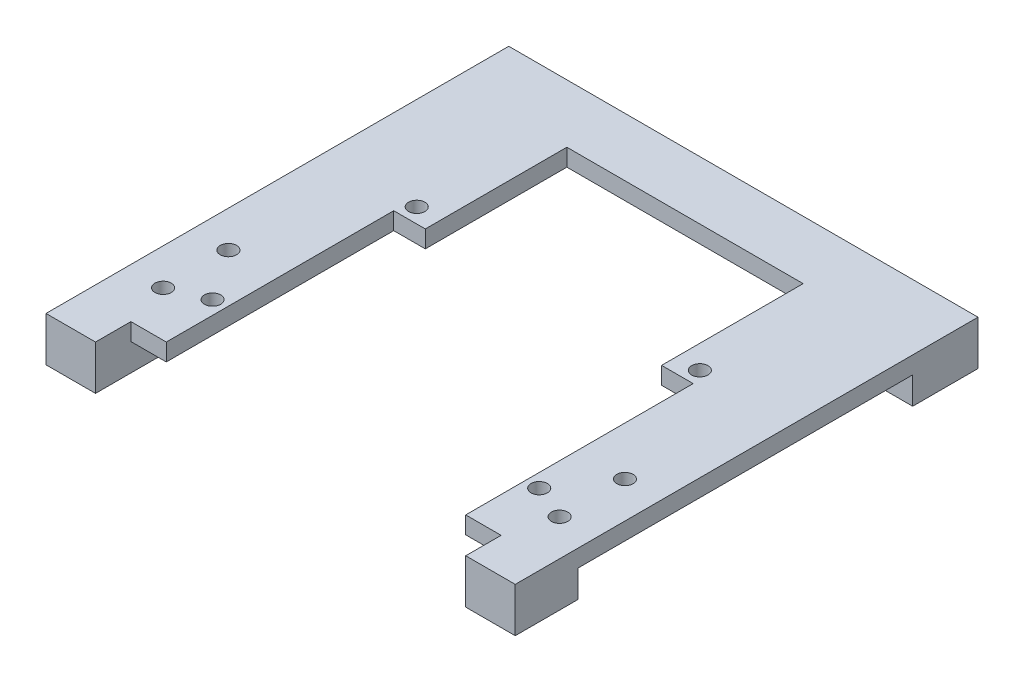
ISO-10303-21;
HEADER;
FILE_DESCRIPTION(('STEP AP214'),'2;1');
FILE_NAME('part.step','',(''),(''),'','','');
FILE_SCHEMA(('AUTOMOTIVE_DESIGN { 1 0 10303 214 1 1 1 1 }'));
ENDSEC;
DATA;
#1=APPLICATION_CONTEXT('core data for automotive mechanical design processes');
#2=APPLICATION_PROTOCOL_DEFINITION('international standard','automotive_design',2000,#1);
#3=PRODUCT_CONTEXT('',#1,'mechanical');
#4=PRODUCT('Part','Part','',(#3));
#5=PRODUCT_RELATED_PRODUCT_CATEGORY('part','',(#4));
#6=PRODUCT_DEFINITION_FORMATION('','',#4);
#7=PRODUCT_DEFINITION_CONTEXT('part definition',#1,'design');
#8=PRODUCT_DEFINITION('design','',#6,#7);
#9=PRODUCT_DEFINITION_SHAPE('','',#8);
#10=(LENGTH_UNIT() NAMED_UNIT(*) SI_UNIT(.MILLI.,.METRE.));
#11=(NAMED_UNIT(*) PLANE_ANGLE_UNIT() SI_UNIT($,.RADIAN.));
#12=(NAMED_UNIT(*) SI_UNIT($,.STERADIAN.) SOLID_ANGLE_UNIT());
#13=UNCERTAINTY_MEASURE_WITH_UNIT(LENGTH_MEASURE(1.E-05),#10,'distance_accuracy_value','');
#14=(GEOMETRIC_REPRESENTATION_CONTEXT(3) GLOBAL_UNCERTAINTY_ASSIGNED_CONTEXT((#13)) GLOBAL_UNIT_ASSIGNED_CONTEXT((#10,
#11,#12)) REPRESENTATION_CONTEXT('',''));
#15=CARTESIAN_POINT('',(0.,0.,0.));
#16=DIRECTION('',(0.,0.,1.));
#17=DIRECTION('',(1.,0.,0.));
#18=AXIS2_PLACEMENT_3D('',#15,#16,#17);
#19=CARTESIAN_POINT('',(27.5,-6.825,58.5499999999924));
#20=DIRECTION('',(1.,0.,0.));
#21=DIRECTION('',(0.,0.,-1.));
#22=AXIS2_PLACEMENT_3D('',#19,#20,#21);
#23=PLANE('',#22);
#24=DIRECTION('',(0.,1.,0.));
#25=VECTOR('',#24,1.);
#26=CARTESIAN_POINT('',(27.5,0.,16.5499999999924));
#27=LINE('',#26,#25);
#28=CARTESIAN_POINT('',(27.5,0.,16.5499999999924));
#29=VERTEX_POINT('',#28);
#30=CARTESIAN_POINT('',(27.5,3.175,16.5499999999924));
#31=VERTEX_POINT('',#30);
#32=EDGE_CURVE('E68',#29,#31,#27,.T.);
#33=ORIENTED_EDGE('',*,*,#32,.F.);
#34=DIRECTION('',(0.,0.,-1.));
#35=VECTOR('',#34,1.);
#36=CARTESIAN_POINT('',(27.5,0.,0.));
#37=LINE('',#36,#35);
#38=CARTESIAN_POINT('',(27.5,0.,58.3266002747816));
#39=VERTEX_POINT('',#38);
#40=EDGE_CURVE('E490',#39,#29,#37,.T.);
#41=ORIENTED_EDGE('',*,*,#40,.F.);
#42=DIRECTION('',(0.,-1.,0.));
#43=VECTOR('',#42,1.);
#44=CARTESIAN_POINT('',(27.5,0.,58.3266002747816));
#45=LINE('',#44,#43);
#46=CARTESIAN_POINT('',(27.5,3.175,58.3266002747816));
#47=VERTEX_POINT('',#46);
#48=EDGE_CURVE('E324',#47,#39,#45,.T.);
#49=ORIENTED_EDGE('',*,*,#48,.F.);
#50=DIRECTION('',(0.,0.,-1.));
#51=VECTOR('',#50,1.);
#52=CARTESIAN_POINT('',(27.5,3.175,58.5499999999924));
#53=LINE('',#52,#51);
#54=EDGE_CURVE('E64',#47,#31,#53,.T.);
#55=ORIENTED_EDGE('',*,*,#54,.T.);
#56=EDGE_LOOP('',(#33,#41,#49,#55));
#57=FACE_BOUND('',#56,.T.);
#58=ADVANCED_FACE('F48',(#57),#23,.F.);
#59=CARTESIAN_POINT('',(-27.5,-6.825,58.5499999999924));
#60=DIRECTION('',(-1.,0.,0.));
#61=DIRECTION('',(0.,0.,1.));
#62=AXIS2_PLACEMENT_3D('',#59,#60,#61);
#63=PLANE('',#62);
#64=DIRECTION('',(0.,-1.,0.));
#65=VECTOR('',#64,1.);
#66=CARTESIAN_POINT('',(-27.5,0.,16.5499999999924));
#67=LINE('',#66,#65);
#68=CARTESIAN_POINT('',(-27.5,3.175,16.5499999999924));
#69=VERTEX_POINT('',#68);
#70=CARTESIAN_POINT('',(-27.5,0.,16.5499999999924));
#71=VERTEX_POINT('',#70);
#72=EDGE_CURVE('E284',#69,#71,#67,.T.);
#73=ORIENTED_EDGE('',*,*,#72,.F.);
#74=DIRECTION('',(0.,0.,1.));
#75=VECTOR('',#74,1.);
#76=CARTESIAN_POINT('',(-27.5,3.175,58.5499999999924));
#77=LINE('',#76,#75);
#78=CARTESIAN_POINT('',(-27.5,3.175,58.3266002747816));
#79=VERTEX_POINT('',#78);
#80=EDGE_CURVE('E485',#69,#79,#77,.T.);
#81=ORIENTED_EDGE('',*,*,#80,.T.);
#82=DIRECTION('',(0.,1.,0.));
#83=VECTOR('',#82,1.);
#84=CARTESIAN_POINT('',(-27.5,0.,58.3266002747816));
#85=LINE('',#84,#83);
#86=CARTESIAN_POINT('',(-27.5,0.,58.3266002747816));
#87=VERTEX_POINT('',#86);
#88=EDGE_CURVE('E344',#87,#79,#85,.T.);
#89=ORIENTED_EDGE('',*,*,#88,.F.);
#90=DIRECTION('',(0.,0.,1.));
#91=VECTOR('',#90,1.);
#92=CARTESIAN_POINT('',(-27.5,0.,0.));
#93=LINE('',#92,#91);
#94=EDGE_CURVE('E493',#71,#87,#93,.T.);
#95=ORIENTED_EDGE('',*,*,#94,.F.);
#96=EDGE_LOOP('',(#73,#81,#89,#95));
#97=FACE_BOUND('',#96,.T.);
#98=ADVANCED_FACE('F613',(#97),#63,.F.);
#99=CARTESIAN_POINT('',(34.,3.175,0.));
#100=DIRECTION('',(-1.,0.,0.));
#101=DIRECTION('',(0.,0.,1.));
#102=AXIS2_PLACEMENT_3D('',#99,#100,#101);
#103=PLANE('',#102);
#104=DIRECTION('',(0.,1.,0.));
#105=VECTOR('',#104,1.);
#106=CARTESIAN_POINT('',(34.,0.,58.3266002747816));
#107=LINE('',#106,#105);
#108=CARTESIAN_POINT('',(34.,0.,58.3266002747816));
#109=VERTEX_POINT('',#108);
#110=CARTESIAN_POINT('',(34.,3.175,58.3266002747816));
#111=VERTEX_POINT('',#110);
#112=EDGE_CURVE('E332',#109,#111,#107,.T.);
#113=ORIENTED_EDGE('',*,*,#112,.F.);
#114=DIRECTION('',(0.,0.,-1.));
#115=VECTOR('',#114,1.);
#116=CARTESIAN_POINT('',(34.,0.,58.3266002747816));
#117=LINE('',#116,#115);
#118=CARTESIAN_POINT('',(34.,0.,53.3266002747816));
#119=VERTEX_POINT('',#118);
#120=EDGE_CURVE('E318',#109,#119,#117,.T.);
#121=ORIENTED_EDGE('',*,*,#120,.T.);
#122=DIRECTION('',(0.,1.,0.));
#123=VECTOR('',#122,1.);
#124=CARTESIAN_POINT('',(34.,-5.,53.3266002747816));
#125=LINE('',#124,#123);
#126=CARTESIAN_POINT('',(34.,-5.,53.3266002747816));
#127=VERTEX_POINT('',#126);
#128=EDGE_CURVE('E407',#127,#119,#125,.T.);
#129=ORIENTED_EDGE('',*,*,#128,.F.);
#130=DIRECTION('',(0.,0.,-1.));
#131=VECTOR('',#130,1.);
#132=CARTESIAN_POINT('',(34.,-5.,64.8266002747816));
#133=LINE('',#132,#131);
#134=CARTESIAN_POINT('',(34.,-5.,64.8266002747816));
#135=VERTEX_POINT('',#134);
#136=EDGE_CURVE('E435',#135,#127,#133,.T.);
#137=ORIENTED_EDGE('',*,*,#136,.F.);
#138=DIRECTION('',(0.,-1.,0.));
#139=VECTOR('',#138,1.);
#140=CARTESIAN_POINT('',(34.,3.175,64.8266002747816));
#141=LINE('',#140,#139);
#142=CARTESIAN_POINT('',(34.,3.175,64.8266002747816));
#143=VERTEX_POINT('',#142);
#144=EDGE_CURVE('E12',#143,#135,#141,.T.);
#145=ORIENTED_EDGE('',*,*,#144,.F.);
#146=DIRECTION('',(0.,0.,-1.));
#147=VECTOR('',#146,1.);
#148=CARTESIAN_POINT('',(34.,3.175,0.));
#149=LINE('',#148,#147);
#150=EDGE_CURVE('E532',#143,#111,#149,.T.);
#151=ORIENTED_EDGE('',*,*,#150,.T.);
#152=EDGE_LOOP('',(#113,#121,#129,#137,#145,#151));
#153=FACE_BOUND('',#152,.T.);
#154=ADVANCED_FACE('F607',(#153),#103,.T.);
#155=CARTESIAN_POINT('',(-34.,3.175,0.));
#156=DIRECTION('',(1.,0.,0.));
#157=DIRECTION('',(0.,0.,-1.));
#158=AXIS2_PLACEMENT_3D('',#155,#156,#157);
#159=PLANE('',#158);
#160=DIRECTION('',(0.,1.,0.));
#161=VECTOR('',#160,1.);
#162=CARTESIAN_POINT('',(-34.,-5.,53.3266002747816));
#163=LINE('',#162,#161);
#164=CARTESIAN_POINT('',(-34.,-5.,53.3266002747816));
#165=VERTEX_POINT('',#164);
#166=CARTESIAN_POINT('',(-34.,0.,53.3266002747816));
#167=VERTEX_POINT('',#166);
#168=EDGE_CURVE('E460',#165,#167,#163,.T.);
#169=ORIENTED_EDGE('',*,*,#168,.T.);
#170=DIRECTION('',(0.,0.,-1.));
#171=VECTOR('',#170,1.);
#172=CARTESIAN_POINT('',(-34.,0.,58.3266002747816));
#173=LINE('',#172,#171);
#174=CARTESIAN_POINT('',(-34.,0.,58.3266002747816));
#175=VERTEX_POINT('',#174);
#176=EDGE_CURVE('E352',#175,#167,#173,.T.);
#177=ORIENTED_EDGE('',*,*,#176,.F.);
#178=DIRECTION('',(0.,-1.,0.));
#179=VECTOR('',#178,1.);
#180=CARTESIAN_POINT('',(-34.,0.,58.3266002747816));
#181=LINE('',#180,#179);
#182=CARTESIAN_POINT('',(-34.,3.175,58.3266002747816));
#183=VERTEX_POINT('',#182);
#184=EDGE_CURVE('E336',#183,#175,#181,.T.);
#185=ORIENTED_EDGE('',*,*,#184,.F.);
#186=DIRECTION('',(0.,0.,1.));
#187=VECTOR('',#186,1.);
#188=CARTESIAN_POINT('',(-34.,3.175,0.));
#189=LINE('',#188,#187);
#190=CARTESIAN_POINT('',(-34.,3.175,64.8266002747816));
#191=VERTEX_POINT('',#190);
#192=EDGE_CURVE('E529',#183,#191,#189,.T.);
#193=ORIENTED_EDGE('',*,*,#192,.T.);
#194=DIRECTION('',(0.,-1.,0.));
#195=VECTOR('',#194,1.);
#196=CARTESIAN_POINT('',(-34.,3.175,64.8266002747816));
#197=LINE('',#196,#195);
#198=CARTESIAN_POINT('',(-34.,-5.,64.8266002747816));
#199=VERTEX_POINT('',#198);
#200=EDGE_CURVE('E551',#191,#199,#197,.T.);
#201=ORIENTED_EDGE('',*,*,#200,.T.);
#202=DIRECTION('',(0.,0.,1.));
#203=VECTOR('',#202,1.);
#204=CARTESIAN_POINT('',(-34.,-5.,64.8266002747816));
#205=LINE('',#204,#203);
#206=EDGE_CURVE('E452',#165,#199,#205,.T.);
#207=ORIENTED_EDGE('',*,*,#206,.F.);
#208=EDGE_LOOP('',(#169,#177,#185,#193,#201,#207));
#209=FACE_BOUND('',#208,.T.);
#210=ADVANCED_FACE('F50',(#209),#159,.T.);
#211=CARTESIAN_POINT('',(0.,0.,0.));
#212=DIRECTION('',(0.,1.,0.));
#213=DIRECTION('',(0.,0.,1.));
#214=AXIS2_PLACEMENT_3D('',#211,#212,#213);
#215=PLANE('',#214);
#216=CARTESIAN_POINT('',(-26.,0.,13.8266002747816));
#217=DIRECTION('',(0.,1.,0.));
#218=DIRECTION('',(0.,0.,1.));
#219=AXIS2_PLACEMENT_3D('',#216,#217,#218);
#220=CIRCLE('',#219,1.5);
#221=CARTESIAN_POINT('',(-26.,0.,15.3266002747816));
#222=VERTEX_POINT('',#221);
#223=EDGE_CURVE('E267',#222,#222,#220,.T.);
#224=ORIENTED_EDGE('',*,*,#223,.T.);
#225=EDGE_LOOP('',(#224));
#226=FACE_BOUND('',#225,.T.);
#227=CARTESIAN_POINT('',(26.,0.,13.8266002747816));
#228=DIRECTION('',(0.,1.,0.));
#229=DIRECTION('',(0.,0.,1.));
#230=AXIS2_PLACEMENT_3D('',#227,#228,#229);
#231=CIRCLE('',#230,1.5);
#232=CARTESIAN_POINT('',(26.,0.,15.3266002747816));
#233=VERTEX_POINT('',#232);
#234=EDGE_CURVE('E260',#233,#233,#231,.T.);
#235=ORIENTED_EDGE('',*,*,#234,.T.);
#236=EDGE_LOOP('',(#235));
#237=FACE_BOUND('',#236,.T.);
#238=DIRECTION('',(-1.,0.,0.));
#239=VECTOR('',#238,1.);
#240=CARTESIAN_POINT('',(0.,0.,-9.45000000000763));
#241=LINE('',#240,#239);
#242=CARTESIAN_POINT('',(21.7,0.,-9.45000000000763));
#243=VERTEX_POINT('',#242);
#244=CARTESIAN_POINT('',(-21.7,0.,-9.45000000000763));
#245=VERTEX_POINT('',#244);
#246=EDGE_CURVE('E239',#243,#245,#241,.T.);
#247=ORIENTED_EDGE('',*,*,#246,.T.);
#248=DIRECTION('',(0.,0.,-1.));
#249=VECTOR('',#248,1.);
#250=CARTESIAN_POINT('',(-21.7,0.,-1.45000000000763));
#251=LINE('',#250,#249);
#252=CARTESIAN_POINT('',(-21.7,0.,16.5499999999924));
#253=VERTEX_POINT('',#252);
#254=EDGE_CURVE('E290',#253,#245,#251,.T.);
#255=ORIENTED_EDGE('',*,*,#254,.F.);
#256=DIRECTION('',(-1.,0.,0.));
#257=VECTOR('',#256,1.);
#258=CARTESIAN_POINT('',(-21.7,0.,16.5499999999924));
#259=LINE('',#258,#257);
#260=EDGE_CURVE('E293',#253,#71,#259,.T.);
#261=ORIENTED_EDGE('',*,*,#260,.T.);
#262=ORIENTED_EDGE('',*,*,#94,.T.);
#263=DIRECTION('',(1.,0.,0.));
#264=VECTOR('',#263,1.);
#265=CARTESIAN_POINT('',(-34.,0.,58.3266002747816));
#266=LINE('',#265,#264);
#267=EDGE_CURVE('E340',#175,#87,#266,.T.);
#268=ORIENTED_EDGE('',*,*,#267,.F.);
#269=ORIENTED_EDGE('',*,*,#176,.T.);
#270=DIRECTION('',(1.,0.,0.));
#271=VECTOR('',#270,1.);
#272=CARTESIAN_POINT('',(-43.0944907722239,0.,53.3266002747816));
#273=LINE('',#272,#271);
#274=CARTESIAN_POINT('',(-43.0944907722239,0.,53.3266002747816));
#275=VERTEX_POINT('',#274);
#276=EDGE_CURVE('E431',#275,#167,#273,.T.);
#277=ORIENTED_EDGE('',*,*,#276,.F.);
#278=DIRECTION('',(0.,0.,-1.));
#279=VECTOR('',#278,1.);
#280=CARTESIAN_POINT('',(-43.0944907722239,0.,0.));
#281=LINE('',#280,#279);
#282=CARTESIAN_POINT('',(-43.0944907722239,0.,-8.17339972521838));
#283=VERTEX_POINT('',#282);
#284=EDGE_CURVE('E533',#275,#283,#281,.T.);
#285=ORIENTED_EDGE('',*,*,#284,.T.);
#286=DIRECTION('',(-1.,0.,0.));
#287=VECTOR('',#286,1.);
#288=CARTESIAN_POINT('',(-43.0944907722239,0.,-8.17339972521838));
#289=LINE('',#288,#287);
#290=CARTESIAN_POINT('',(-35.0944907722239,0.,-8.17339972521838));
#291=VERTEX_POINT('',#290);
#292=EDGE_CURVE('E400',#291,#283,#289,.T.);
#293=ORIENTED_EDGE('',*,*,#292,.F.);
#294=DIRECTION('',(0.,0.,1.));
#295=VECTOR('',#294,1.);
#296=CARTESIAN_POINT('',(-35.0944907722239,0.,-20.1733997252184));
#297=LINE('',#296,#295);
#298=CARTESIAN_POINT('',(-35.0944907722239,0.,-20.1733997252184));
#299=VERTEX_POINT('',#298);
#300=EDGE_CURVE('E403',#299,#291,#297,.T.);
#301=ORIENTED_EDGE('',*,*,#300,.F.);
#302=DIRECTION('',(-1.,0.,0.));
#303=VECTOR('',#302,1.);
#304=CARTESIAN_POINT('',(0.,0.,-20.1733997252184));
#305=LINE('',#304,#303);
#306=CARTESIAN_POINT('',(35.0944907722239,0.,-20.1733997252184));
#307=VERTEX_POINT('',#306);
#308=EDGE_CURVE('E479',#307,#299,#305,.T.);
#309=ORIENTED_EDGE('',*,*,#308,.F.);
#310=DIRECTION('',(0.,0.,-1.));
#311=VECTOR('',#310,1.);
#312=CARTESIAN_POINT('',(35.0944907722239,0.,-20.1733997252184));
#313=LINE('',#312,#311);
#314=CARTESIAN_POINT('',(35.0944907722239,0.,-8.17339972521838));
#315=VERTEX_POINT('',#314);
#316=EDGE_CURVE('E367',#315,#307,#313,.T.);
#317=ORIENTED_EDGE('',*,*,#316,.F.);
#318=DIRECTION('',(-1.,0.,0.));
#319=VECTOR('',#318,1.);
#320=CARTESIAN_POINT('',(43.0944907722239,0.,-8.17339972521838));
#321=LINE('',#320,#319);
#322=CARTESIAN_POINT('',(43.0944907722239,0.,-8.17339972521838));
#323=VERTEX_POINT('',#322);
#324=EDGE_CURVE('E371',#323,#315,#321,.T.);
#325=ORIENTED_EDGE('',*,*,#324,.F.);
#326=DIRECTION('',(0.,0.,-1.));
#327=VECTOR('',#326,1.);
#328=CARTESIAN_POINT('',(43.0944907722239,0.,0.));
#329=LINE('',#328,#327);
#330=CARTESIAN_POINT('',(43.0944907722239,0.,53.3266002747816));
#331=VERTEX_POINT('',#330);
#332=EDGE_CURVE('E528',#331,#323,#329,.T.);
#333=ORIENTED_EDGE('',*,*,#332,.F.);
#334=DIRECTION('',(1.,0.,0.));
#335=VECTOR('',#334,1.);
#336=CARTESIAN_POINT('',(43.0944907722239,0.,53.3266002747816));
#337=LINE('',#336,#335);
#338=EDGE_CURVE('E427',#119,#331,#337,.T.);
#339=ORIENTED_EDGE('',*,*,#338,.F.);
#340=ORIENTED_EDGE('',*,*,#120,.F.);
#341=DIRECTION('',(1.,0.,0.));
#342=VECTOR('',#341,1.);
#343=CARTESIAN_POINT('',(34.,0.,58.3266002747816));
#344=LINE('',#343,#342);
#345=EDGE_CURVE('E321',#39,#109,#344,.T.);
#346=ORIENTED_EDGE('',*,*,#345,.F.);
#347=ORIENTED_EDGE('',*,*,#40,.T.);
#348=DIRECTION('',(1.,0.,0.));
#349=VECTOR('',#348,1.);
#350=CARTESIAN_POINT('',(21.7,0.,16.5499999999924));
#351=LINE('',#350,#349);
#352=CARTESIAN_POINT('',(21.7,0.,16.5499999999924));
#353=VERTEX_POINT('',#352);
#354=EDGE_CURVE('E280',#353,#29,#351,.T.);
#355=ORIENTED_EDGE('',*,*,#354,.F.);
#356=DIRECTION('',(0.,0.,1.));
#357=VECTOR('',#356,1.);
#358=CARTESIAN_POINT('',(21.7,0.,-1.45000000000762));
#359=LINE('',#358,#357);
#360=EDGE_CURVE('E271',#243,#353,#359,.T.);
#361=ORIENTED_EDGE('',*,*,#360,.F.);
#362=EDGE_LOOP('',(#247,#255,#261,#262,#268,#269,#277,#285,#293,#301,#309,#317,#325,#333,#339,
#340,#346,#347,#355,#361));
#363=FACE_BOUND('',#362,.T.);
#364=CARTESIAN_POINT('',(-30.,0.,47.3266002747816));
#365=DIRECTION('',(0.,1.,0.));
#366=DIRECTION('',(0.,0.,1.));
#367=AXIS2_PLACEMENT_3D('',#364,#365,#366);
#368=CIRCLE('',#367,1.5);
#369=CARTESIAN_POINT('',(-30.,0.,48.8266002747816));
#370=VERTEX_POINT('',#369);
#371=EDGE_CURVE('E314',#370,#370,#368,.T.);
#372=ORIENTED_EDGE('',*,*,#371,.T.);
#373=EDGE_LOOP('',(#372));
#374=FACE_BOUND('',#373,.T.);
#375=CARTESIAN_POINT('',(30.,0.,47.3266002747816));
#376=DIRECTION('',(0.,1.,0.));
#377=DIRECTION('',(0.,0.,1.));
#378=AXIS2_PLACEMENT_3D('',#375,#376,#377);
#379=CIRCLE('',#378,1.5);
#380=CARTESIAN_POINT('',(30.,0.,48.8266002747816));
#381=VERTEX_POINT('',#380);
#382=EDGE_CURVE('E307',#381,#381,#379,.T.);
#383=ORIENTED_EDGE('',*,*,#382,.T.);
#384=EDGE_LOOP('',(#383));
#385=FACE_BOUND('',#384,.T.);
#386=CARTESIAN_POINT('',(36.415,0.,38.));
#387=DIRECTION('',(0.,-1.,0.));
#388=DIRECTION('',(0.,0.,-1.));
#389=AXIS2_PLACEMENT_3D('',#386,#387,#388);
#390=CIRCLE('',#389,1.5);
#391=CARTESIAN_POINT('',(36.415,0.,36.5));
#392=VERTEX_POINT('',#391);
#393=EDGE_CURVE('E520',#392,#392,#390,.T.);
#394=ORIENTED_EDGE('',*,*,#393,.F.);
#395=EDGE_LOOP('',(#394));
#396=FACE_BOUND('',#395,.T.);
#397=CARTESIAN_POINT('',(36.415,0.,50.));
#398=DIRECTION('',(0.,-1.,0.));
#399=DIRECTION('',(0.,0.,-1.));
#400=AXIS2_PLACEMENT_3D('',#397,#398,#399);
#401=CIRCLE('',#400,1.5);
#402=CARTESIAN_POINT('',(36.415,0.,48.5));
#403=VERTEX_POINT('',#402);
#404=EDGE_CURVE('E512',#403,#403,#401,.T.);
#405=ORIENTED_EDGE('',*,*,#404,.F.);
#406=EDGE_LOOP('',(#405));
#407=FACE_BOUND('',#406,.T.);
#408=CARTESIAN_POINT('',(-36.415,0.,38.));
#409=DIRECTION('',(0.,-1.,0.));
#410=DIRECTION('',(0.,0.,-1.));
#411=AXIS2_PLACEMENT_3D('',#408,#409,#410);
#412=CIRCLE('',#411,1.5);
#413=CARTESIAN_POINT('',(-36.415,0.,36.5));
#414=VERTEX_POINT('',#413);
#415=EDGE_CURVE('E504',#414,#414,#412,.T.);
#416=ORIENTED_EDGE('',*,*,#415,.F.);
#417=EDGE_LOOP('',(#416));
#418=FACE_BOUND('',#417,.T.);
#419=CARTESIAN_POINT('',(-36.415,0.,50.));
#420=DIRECTION('',(0.,-1.,0.));
#421=DIRECTION('',(0.,0.,-1.));
#422=AXIS2_PLACEMENT_3D('',#419,#420,#421);
#423=CIRCLE('',#422,1.5);
#424=CARTESIAN_POINT('',(-36.415,0.,48.5));
#425=VERTEX_POINT('',#424);
#426=EDGE_CURVE('E496',#425,#425,#423,.T.);
#427=ORIENTED_EDGE('',*,*,#426,.F.);
#428=EDGE_LOOP('',(#427));
#429=FACE_BOUND('',#428,.T.);
#430=ADVANCED_FACE('F584',(#226,#237,#363,#374,#385,#396,#407,#418,#429),#215,.F.);
#431=CARTESIAN_POINT('',(0.,3.175,0.));
#432=DIRECTION('',(0.,1.,0.));
#433=DIRECTION('',(0.,0.,1.));
#434=AXIS2_PLACEMENT_3D('',#431,#432,#433);
#435=PLANE('',#434);
#436=DIRECTION('',(0.,0.,1.));
#437=VECTOR('',#436,1.);
#438=CARTESIAN_POINT('',(-21.7,3.175,-1.45000000000763));
#439=LINE('',#438,#437);
#440=CARTESIAN_POINT('',(-21.7,3.175,-9.45000000000763));
#441=VERTEX_POINT('',#440);
#442=CARTESIAN_POINT('',(-21.7,3.175,16.5499999999924));
#443=VERTEX_POINT('',#442);
#444=EDGE_CURVE('E246',#441,#443,#439,.T.);
#445=ORIENTED_EDGE('',*,*,#444,.F.);
#446=DIRECTION('',(-1.,0.,0.));
#447=VECTOR('',#446,1.);
#448=CARTESIAN_POINT('',(-21.7,3.175,-9.45000000000763));
#449=LINE('',#448,#447);
#450=CARTESIAN_POINT('',(21.7,3.175,-9.45000000000763));
#451=VERTEX_POINT('',#450);
#452=EDGE_CURVE('E237',#451,#441,#449,.T.);
#453=ORIENTED_EDGE('',*,*,#452,.F.);
#454=DIRECTION('',(0.,0.,-1.));
#455=VECTOR('',#454,1.);
#456=CARTESIAN_POINT('',(21.7,3.175,-1.45000000000762));
#457=LINE('',#456,#455);
#458=CARTESIAN_POINT('',(21.7,3.175,16.5499999999924));
#459=VERTEX_POINT('',#458);
#460=EDGE_CURVE('E219',#459,#451,#457,.T.);
#461=ORIENTED_EDGE('',*,*,#460,.F.);
#462=DIRECTION('',(1.,0.,0.));
#463=VECTOR('',#462,1.);
#464=CARTESIAN_POINT('',(21.7,3.175,16.5499999999924));
#465=LINE('',#464,#463);
#466=EDGE_CURVE('E230',#459,#31,#465,.T.);
#467=ORIENTED_EDGE('',*,*,#466,.T.);
#468=ORIENTED_EDGE('',*,*,#54,.F.);
#469=DIRECTION('',(-1.,0.,0.));
#470=VECTOR('',#469,1.);
#471=CARTESIAN_POINT('',(34.,3.175,58.3266002747816));
#472=LINE('',#471,#470);
#473=EDGE_CURVE('E328',#111,#47,#472,.T.);
#474=ORIENTED_EDGE('',*,*,#473,.F.);
#475=ORIENTED_EDGE('',*,*,#150,.F.);
#476=DIRECTION('',(-1.,0.,0.));
#477=VECTOR('',#476,1.);
#478=CARTESIAN_POINT('',(0.,3.175,64.8266002747816));
#479=LINE('',#478,#477);
#480=CARTESIAN_POINT('',(43.0944907722239,3.175,64.8266002747816));
#481=VERTEX_POINT('',#480);
#482=EDGE_CURVE('E537',#481,#143,#479,.T.);
#483=ORIENTED_EDGE('',*,*,#482,.F.);
#484=DIRECTION('',(0.,0.,-1.));
#485=VECTOR('',#484,1.);
#486=CARTESIAN_POINT('',(43.0944907722239,3.175,0.));
#487=LINE('',#486,#485);
#488=CARTESIAN_POINT('',(43.0944907722239,3.175,-20.1733997252184));
#489=VERTEX_POINT('',#488);
#490=EDGE_CURVE('E541',#481,#489,#487,.T.);
#491=ORIENTED_EDGE('',*,*,#490,.T.);
#492=DIRECTION('',(-1.,0.,0.));
#493=VECTOR('',#492,1.);
#494=CARTESIAN_POINT('',(-43.0944907722239,3.175,-20.1733997252184));
#495=LINE('',#494,#493);
#496=CARTESIAN_POINT('',(-43.0944907722239,3.175,-20.1733997252184));
#497=VERTEX_POINT('',#496);
#498=EDGE_CURVE('E470',#489,#497,#495,.T.);
#499=ORIENTED_EDGE('',*,*,#498,.T.);
#500=DIRECTION('',(0.,0.,-1.));
#501=VECTOR('',#500,1.);
#502=CARTESIAN_POINT('',(-43.0944907722239,3.175,0.));
#503=LINE('',#502,#501);
#504=CARTESIAN_POINT('',(-43.0944907722239,3.175,64.8266002747816));
#505=VERTEX_POINT('',#504);
#506=EDGE_CURVE('E544',#505,#497,#503,.T.);
#507=ORIENTED_EDGE('',*,*,#506,.F.);
#508=DIRECTION('',(1.,0.,0.));
#509=VECTOR('',#508,1.);
#510=CARTESIAN_POINT('',(0.,3.175,64.8266002747816));
#511=LINE('',#510,#509);
#512=EDGE_CURVE('E547',#505,#191,#511,.T.);
#513=ORIENTED_EDGE('',*,*,#512,.T.);
#514=ORIENTED_EDGE('',*,*,#192,.F.);
#515=DIRECTION('',(-1.,0.,0.));
#516=VECTOR('',#515,1.);
#517=CARTESIAN_POINT('',(-34.,3.175,58.3266002747816));
#518=LINE('',#517,#516);
#519=EDGE_CURVE('E348',#79,#183,#518,.T.);
#520=ORIENTED_EDGE('',*,*,#519,.F.);
#521=ORIENTED_EDGE('',*,*,#80,.F.);
#522=DIRECTION('',(-1.,0.,0.));
#523=VECTOR('',#522,1.);
#524=CARTESIAN_POINT('',(-21.7,3.175,16.5499999999924));
#525=LINE('',#524,#523);
#526=EDGE_CURVE('E299',#443,#69,#525,.T.);
#527=ORIENTED_EDGE('',*,*,#526,.F.);
#528=EDGE_LOOP('',(#445,#453,#461,#467,#468,#474,#475,#483,#491,#499,#507,#513,#514,#520,#521,#527));
#529=FACE_BOUND('',#528,.T.);
#530=CARTESIAN_POINT('',(-26.,3.175,13.8266002747816));
#531=DIRECTION('',(0.,1.,0.));
#532=DIRECTION('',(0.,0.,1.));
#533=AXIS2_PLACEMENT_3D('',#530,#531,#532);
#534=CIRCLE('',#533,1.5);
#535=CARTESIAN_POINT('',(-26.,3.175,15.3266002747816));
#536=VERTEX_POINT('',#535);
#537=EDGE_CURVE('E256',#536,#536,#534,.T.);
#538=ORIENTED_EDGE('',*,*,#537,.F.);
#539=EDGE_LOOP('',(#538));
#540=FACE_BOUND('',#539,.T.);
#541=CARTESIAN_POINT('',(26.,3.175,13.8266002747816));
#542=DIRECTION('',(0.,1.,0.));
#543=DIRECTION('',(0.,0.,1.));
#544=AXIS2_PLACEMENT_3D('',#541,#542,#543);
#545=CIRCLE('',#544,1.5);
#546=CARTESIAN_POINT('',(26.,3.175,15.3266002747816));
#547=VERTEX_POINT('',#546);
#548=EDGE_CURVE('E255',#547,#547,#545,.T.);
#549=ORIENTED_EDGE('',*,*,#548,.F.);
#550=EDGE_LOOP('',(#549));
#551=FACE_BOUND('',#550,.T.);
#552=CARTESIAN_POINT('',(-30.,3.175,47.3266002747816));
#553=DIRECTION('',(0.,1.,0.));
#554=DIRECTION('',(0.,0.,1.));
#555=AXIS2_PLACEMENT_3D('',#552,#553,#554);
#556=CIRCLE('',#555,1.5);
#557=CARTESIAN_POINT('',(-30.,3.175,48.8266002747816));
#558=VERTEX_POINT('',#557);
#559=EDGE_CURVE('E303',#558,#558,#556,.T.);
#560=ORIENTED_EDGE('',*,*,#559,.F.);
#561=EDGE_LOOP('',(#560));
#562=FACE_BOUND('',#561,.T.);
#563=CARTESIAN_POINT('',(30.,3.175,47.3266002747816));
#564=DIRECTION('',(0.,1.,0.));
#565=DIRECTION('',(0.,0.,1.));
#566=AXIS2_PLACEMENT_3D('',#563,#564,#565);
#567=CIRCLE('',#566,1.5);
#568=CARTESIAN_POINT('',(30.,3.175,48.8266002747816));
#569=VERTEX_POINT('',#568);
#570=EDGE_CURVE('E302',#569,#569,#567,.T.);
#571=ORIENTED_EDGE('',*,*,#570,.F.);
#572=EDGE_LOOP('',(#571));
#573=FACE_BOUND('',#572,.T.);
#574=CARTESIAN_POINT('',(36.415,3.175,38.));
#575=DIRECTION('',(0.,-1.,0.));
#576=DIRECTION('',(0.,0.,-1.));
#577=AXIS2_PLACEMENT_3D('',#574,#575,#576);
#578=CIRCLE('',#577,1.5);
#579=CARTESIAN_POINT('',(36.415,3.175,36.5));
#580=VERTEX_POINT('',#579);
#581=EDGE_CURVE('E524',#580,#580,#578,.T.);
#582=ORIENTED_EDGE('',*,*,#581,.T.);
#583=EDGE_LOOP('',(#582));
#584=FACE_BOUND('',#583,.T.);
#585=CARTESIAN_POINT('',(36.415,3.175,50.));
#586=DIRECTION('',(0.,-1.,0.));
#587=DIRECTION('',(0.,0.,-1.));
#588=AXIS2_PLACEMENT_3D('',#585,#586,#587);
#589=CIRCLE('',#588,1.5);
#590=CARTESIAN_POINT('',(36.415,3.175,48.5));
#591=VERTEX_POINT('',#590);
#592=EDGE_CURVE('E516',#591,#591,#589,.T.);
#593=ORIENTED_EDGE('',*,*,#592,.T.);
#594=EDGE_LOOP('',(#593));
#595=FACE_BOUND('',#594,.T.);
#596=CARTESIAN_POINT('',(-36.415,3.175,38.));
#597=DIRECTION('',(0.,-1.,0.));
#598=DIRECTION('',(0.,0.,-1.));
#599=AXIS2_PLACEMENT_3D('',#596,#597,#598);
#600=CIRCLE('',#599,1.5);
#601=CARTESIAN_POINT('',(-36.415,3.175,36.5));
#602=VERTEX_POINT('',#601);
#603=EDGE_CURVE('E508',#602,#602,#600,.T.);
#604=ORIENTED_EDGE('',*,*,#603,.T.);
#605=EDGE_LOOP('',(#604));
#606=FACE_BOUND('',#605,.T.);
#607=CARTESIAN_POINT('',(-36.415,3.175,50.));
#608=DIRECTION('',(0.,-1.,0.));
#609=DIRECTION('',(0.,0.,-1.));
#610=AXIS2_PLACEMENT_3D('',#607,#608,#609);
#611=CIRCLE('',#610,1.5);
#612=CARTESIAN_POINT('',(-36.415,3.175,48.5));
#613=VERTEX_POINT('',#612);
#614=EDGE_CURVE('E500',#613,#613,#611,.T.);
#615=ORIENTED_EDGE('',*,*,#614,.T.);
#616=EDGE_LOOP('',(#615));
#617=FACE_BOUND('',#616,.T.);
#618=ADVANCED_FACE('F243',(#529,#540,#551,#562,#573,#584,#595,#606,#617),#435,.T.);
#619=CARTESIAN_POINT('',(43.0944907722239,3.175,0.));
#620=DIRECTION('',(-1.,0.,0.));
#621=DIRECTION('',(0.,0.,1.));
#622=AXIS2_PLACEMENT_3D('',#619,#620,#621);
#623=PLANE('',#622);
#624=DIRECTION('',(0.,-1.,0.));
#625=VECTOR('',#624,1.);
#626=CARTESIAN_POINT('',(43.0944907722239,3.175,64.8266002747816));
#627=LINE('',#626,#625);
#628=CARTESIAN_POINT('',(43.0944907722239,-5.,64.8266002747816));
#629=VERTEX_POINT('',#628);
#630=EDGE_CURVE('E57',#481,#629,#627,.T.);
#631=ORIENTED_EDGE('',*,*,#630,.T.);
#632=DIRECTION('',(0.,0.,1.));
#633=VECTOR('',#632,1.);
#634=CARTESIAN_POINT('',(43.0944907722239,-5.,64.8266002747816));
#635=LINE('',#634,#633);
#636=CARTESIAN_POINT('',(43.0944907722239,-5.,53.3266002747816));
#637=VERTEX_POINT('',#636);
#638=EDGE_CURVE('E432',#637,#629,#635,.T.);
#639=ORIENTED_EDGE('',*,*,#638,.F.);
#640=DIRECTION('',(0.,1.,0.));
#641=VECTOR('',#640,1.);
#642=CARTESIAN_POINT('',(43.0944907722239,-5.,53.3266002747816));
#643=LINE('',#642,#641);
#644=EDGE_CURVE('E422',#637,#331,#643,.T.);
#645=ORIENTED_EDGE('',*,*,#644,.T.);
#646=ORIENTED_EDGE('',*,*,#332,.T.);
#647=DIRECTION('',(0.,1.,0.));
#648=VECTOR('',#647,1.);
#649=CARTESIAN_POINT('',(43.0944907722239,-5.,-8.17339972521838));
#650=LINE('',#649,#648);
#651=CARTESIAN_POINT('',(43.0944907722239,-5.,-8.17339972521838));
#652=VERTEX_POINT('',#651);
#653=EDGE_CURVE('E356',#652,#323,#650,.T.);
#654=ORIENTED_EDGE('',*,*,#653,.F.);
#655=DIRECTION('',(0.,0.,1.));
#656=VECTOR('',#655,1.);
#657=CARTESIAN_POINT('',(43.0944907722239,-5.,-20.1733997252184));
#658=LINE('',#657,#656);
#659=CARTESIAN_POINT('',(43.0944907722239,-5.,-20.1733997252184));
#660=VERTEX_POINT('',#659);
#661=EDGE_CURVE('E372',#660,#652,#658,.T.);
#662=ORIENTED_EDGE('',*,*,#661,.F.);
#663=DIRECTION('',(0.,1.,0.));
#664=VECTOR('',#663,1.);
#665=CARTESIAN_POINT('',(43.0944907722239,-6.825,-20.1733997252184));
#666=LINE('',#665,#664);
#667=EDGE_CURVE('E474',#660,#489,#666,.T.);
#668=ORIENTED_EDGE('',*,*,#667,.T.);
#669=ORIENTED_EDGE('',*,*,#490,.F.);
#670=EDGE_LOOP('',(#631,#639,#645,#646,#654,#662,#668,#669));
#671=FACE_BOUND('',#670,.T.);
#672=ADVANCED_FACE('F567',(#671),#623,.F.);
#673=CARTESIAN_POINT('',(0.,3.175,64.8266002747816));
#674=DIRECTION('',(0.,0.,1.));
#675=DIRECTION('',(1.,0.,0.));
#676=AXIS2_PLACEMENT_3D('',#673,#674,#675);
#677=PLANE('',#676);
#678=ORIENTED_EDGE('',*,*,#144,.T.);
#679=DIRECTION('',(-1.,0.,0.));
#680=VECTOR('',#679,1.);
#681=CARTESIAN_POINT('',(43.0944907722239,-5.,64.8266002747816));
#682=LINE('',#681,#680);
#683=EDGE_CURVE('E438',#629,#135,#682,.T.);
#684=ORIENTED_EDGE('',*,*,#683,.F.);
#685=ORIENTED_EDGE('',*,*,#630,.F.);
#686=ORIENTED_EDGE('',*,*,#482,.T.);
#687=EDGE_LOOP('',(#678,#684,#685,#686));
#688=FACE_BOUND('',#687,.T.);
#689=ADVANCED_FACE('F570',(#688),#677,.T.);
#690=CARTESIAN_POINT('',(-43.0944907722239,3.175,0.));
#691=DIRECTION('',(-1.,0.,0.));
#692=DIRECTION('',(0.,0.,1.));
#693=AXIS2_PLACEMENT_3D('',#690,#691,#692);
#694=PLANE('',#693);
#695=ORIENTED_EDGE('',*,*,#506,.T.);
#696=DIRECTION('',(0.,1.,0.));
#697=VECTOR('',#696,1.);
#698=CARTESIAN_POINT('',(-43.0944907722239,-6.825,-20.1733997252184));
#699=LINE('',#698,#697);
#700=CARTESIAN_POINT('',(-43.0944907722239,-5.,-20.1733997252184));
#701=VERTEX_POINT('',#700);
#702=EDGE_CURVE('E475',#701,#497,#699,.T.);
#703=ORIENTED_EDGE('',*,*,#702,.F.);
#704=DIRECTION('',(0.,0.,-1.));
#705=VECTOR('',#704,1.);
#706=CARTESIAN_POINT('',(-43.0944907722239,-5.,-20.1733997252184));
#707=LINE('',#706,#705);
#708=CARTESIAN_POINT('',(-43.0944907722239,-5.,-8.17339972521838));
#709=VERTEX_POINT('',#708);
#710=EDGE_CURVE('E404',#709,#701,#707,.T.);
#711=ORIENTED_EDGE('',*,*,#710,.F.);
#712=DIRECTION('',(0.,1.,0.));
#713=VECTOR('',#712,1.);
#714=CARTESIAN_POINT('',(-43.0944907722239,-5.,-8.17339972521838));
#715=LINE('',#714,#713);
#716=EDGE_CURVE('E395',#709,#283,#715,.T.);
#717=ORIENTED_EDGE('',*,*,#716,.T.);
#718=ORIENTED_EDGE('',*,*,#284,.F.);
#719=DIRECTION('',(0.,1.,0.));
#720=VECTOR('',#719,1.);
#721=CARTESIAN_POINT('',(-43.0944907722239,-5.,53.3266002747816));
#722=LINE('',#721,#720);
#723=CARTESIAN_POINT('',(-43.0944907722239,-5.,53.3266002747816));
#724=VERTEX_POINT('',#723);
#725=EDGE_CURVE('E466',#724,#275,#722,.T.);
#726=ORIENTED_EDGE('',*,*,#725,.F.);
#727=DIRECTION('',(0.,0.,-1.));
#728=VECTOR('',#727,1.);
#729=CARTESIAN_POINT('',(-43.0944907722239,-5.,64.8266002747816));
#730=LINE('',#729,#728);
#731=CARTESIAN_POINT('',(-43.0944907722239,-5.,64.8266002747816));
#732=VERTEX_POINT('',#731);
#733=EDGE_CURVE('E445',#732,#724,#730,.T.);
#734=ORIENTED_EDGE('',*,*,#733,.F.);
#735=DIRECTION('',(0.,-1.,0.));
#736=VECTOR('',#735,1.);
#737=CARTESIAN_POINT('',(-43.0944907722239,3.175,64.8266002747816));
#738=LINE('',#737,#736);
#739=EDGE_CURVE('E560',#505,#732,#738,.T.);
#740=ORIENTED_EDGE('',*,*,#739,.F.);
#741=EDGE_LOOP('',(#695,#703,#711,#717,#718,#726,#734,#740));
#742=FACE_BOUND('',#741,.T.);
#743=ADVANCED_FACE('F647',(#742),#694,.T.);
#744=CARTESIAN_POINT('',(0.,3.175,64.8266002747816));
#745=DIRECTION('',(0.,0.,-1.));
#746=DIRECTION('',(-1.,0.,0.));
#747=AXIS2_PLACEMENT_3D('',#744,#745,#746);
#748=PLANE('',#747);
#749=ORIENTED_EDGE('',*,*,#739,.T.);
#750=DIRECTION('',(-1.,0.,0.));
#751=VECTOR('',#750,1.);
#752=CARTESIAN_POINT('',(-43.0944907722239,-5.,64.8266002747816));
#753=LINE('',#752,#751);
#754=EDGE_CURVE('E456',#199,#732,#753,.T.);
#755=ORIENTED_EDGE('',*,*,#754,.F.);
#756=ORIENTED_EDGE('',*,*,#200,.F.);
#757=ORIENTED_EDGE('',*,*,#512,.F.);
#758=EDGE_LOOP('',(#749,#755,#756,#757));
#759=FACE_BOUND('',#758,.T.);
#760=ADVANCED_FACE('F638',(#759),#748,.F.);
#761=CARTESIAN_POINT('',(36.415,0.,38.));
#762=DIRECTION('',(0.,-1.,0.));
#763=DIRECTION('',(0.,0.,-1.));
#764=AXIS2_PLACEMENT_3D('',#761,#762,#763);
#765=CYLINDRICAL_SURFACE('',#764,1.5);
#766=ORIENTED_EDGE('',*,*,#581,.F.);
#767=EDGE_LOOP('',(#766));
#768=FACE_BOUND('',#767,.T.);
#769=ORIENTED_EDGE('',*,*,#393,.T.);
#770=EDGE_LOOP('',(#769));
#771=FACE_BOUND('',#770,.T.);
#772=ADVANCED_FACE('F634',(#768,#771),#765,.F.);
#773=CARTESIAN_POINT('',(36.415,0.,50.));
#774=DIRECTION('',(0.,-1.,0.));
#775=DIRECTION('',(0.,0.,-1.));
#776=AXIS2_PLACEMENT_3D('',#773,#774,#775);
#777=CYLINDRICAL_SURFACE('',#776,1.5);
#778=ORIENTED_EDGE('',*,*,#592,.F.);
#779=EDGE_LOOP('',(#778));
#780=FACE_BOUND('',#779,.T.);
#781=ORIENTED_EDGE('',*,*,#404,.T.);
#782=EDGE_LOOP('',(#781));
#783=FACE_BOUND('',#782,.T.);
#784=ADVANCED_FACE('F630',(#780,#783),#777,.F.);
#785=CARTESIAN_POINT('',(-36.415,0.,38.));
#786=DIRECTION('',(0.,-1.,0.));
#787=DIRECTION('',(0.,0.,-1.));
#788=AXIS2_PLACEMENT_3D('',#785,#786,#787);
#789=CYLINDRICAL_SURFACE('',#788,1.5);
#790=ORIENTED_EDGE('',*,*,#603,.F.);
#791=EDGE_LOOP('',(#790));
#792=FACE_BOUND('',#791,.T.);
#793=ORIENTED_EDGE('',*,*,#415,.T.);
#794=EDGE_LOOP('',(#793));
#795=FACE_BOUND('',#794,.T.);
#796=ADVANCED_FACE('F626',(#792,#795),#789,.F.);
#797=CARTESIAN_POINT('',(-36.415,0.,50.));
#798=DIRECTION('',(0.,-1.,0.));
#799=DIRECTION('',(0.,0.,-1.));
#800=AXIS2_PLACEMENT_3D('',#797,#798,#799);
#801=CYLINDRICAL_SURFACE('',#800,1.5);
#802=ORIENTED_EDGE('',*,*,#614,.F.);
#803=EDGE_LOOP('',(#802));
#804=FACE_BOUND('',#803,.T.);
#805=ORIENTED_EDGE('',*,*,#426,.T.);
#806=EDGE_LOOP('',(#805));
#807=FACE_BOUND('',#806,.T.);
#808=ADVANCED_FACE('F624',(#804,#807),#801,.F.);
#809=CARTESIAN_POINT('',(-43.0944907722239,-6.825,-20.1733997252184));
#810=DIRECTION('',(0.,0.,-1.));
#811=DIRECTION('',(-1.,0.,0.));
#812=AXIS2_PLACEMENT_3D('',#809,#810,#811);
#813=PLANE('',#812);
#814=ORIENTED_EDGE('',*,*,#667,.F.);
#815=DIRECTION('',(1.,0.,0.));
#816=VECTOR('',#815,1.);
#817=CARTESIAN_POINT('',(43.0944907722239,-5.,-20.1733997252184));
#818=LINE('',#817,#816);
#819=CARTESIAN_POINT('',(35.0944907722239,-5.,-20.1733997252184));
#820=VERTEX_POINT('',#819);
#821=EDGE_CURVE('E366',#820,#660,#818,.T.);
#822=ORIENTED_EDGE('',*,*,#821,.F.);
#823=DIRECTION('',(0.,1.,0.));
#824=VECTOR('',#823,1.);
#825=CARTESIAN_POINT('',(35.0944907722239,-5.,-20.1733997252184));
#826=LINE('',#825,#824);
#827=EDGE_CURVE('E363',#820,#307,#826,.T.);
#828=ORIENTED_EDGE('',*,*,#827,.T.);
#829=ORIENTED_EDGE('',*,*,#308,.T.);
#830=DIRECTION('',(0.,1.,0.));
#831=VECTOR('',#830,1.);
#832=CARTESIAN_POINT('',(-35.0944907722239,-5.,-20.1733997252184));
#833=LINE('',#832,#831);
#834=CARTESIAN_POINT('',(-35.0944907722239,-5.,-20.1733997252184));
#835=VERTEX_POINT('',#834);
#836=EDGE_CURVE('E375',#835,#299,#833,.T.);
#837=ORIENTED_EDGE('',*,*,#836,.F.);
#838=DIRECTION('',(1.,0.,0.));
#839=VECTOR('',#838,1.);
#840=CARTESIAN_POINT('',(-43.0944907722239,-5.,-20.1733997252184));
#841=LINE('',#840,#839);
#842=EDGE_CURVE('E413',#701,#835,#841,.T.);
#843=ORIENTED_EDGE('',*,*,#842,.F.);
#844=ORIENTED_EDGE('',*,*,#702,.T.);
#845=ORIENTED_EDGE('',*,*,#498,.F.);
#846=EDGE_LOOP('',(#814,#822,#828,#829,#837,#843,#844,#845));
#847=FACE_BOUND('',#846,.T.);
#848=ADVANCED_FACE('F601',(#847),#813,.T.);
#849=CARTESIAN_POINT('',(-43.0944907722239,-5.,53.3266002747816));
#850=DIRECTION('',(0.,0.,1.));
#851=DIRECTION('',(1.,0.,0.));
#852=AXIS2_PLACEMENT_3D('',#849,#850,#851);
#853=PLANE('',#852);
#854=ORIENTED_EDGE('',*,*,#276,.T.);
#855=ORIENTED_EDGE('',*,*,#168,.F.);
#856=DIRECTION('',(1.,0.,0.));
#857=VECTOR('',#856,1.);
#858=CARTESIAN_POINT('',(-43.0944907722239,-5.,53.3266002747816));
#859=LINE('',#858,#857);
#860=EDGE_CURVE('E449',#724,#165,#859,.T.);
#861=ORIENTED_EDGE('',*,*,#860,.F.);
#862=ORIENTED_EDGE('',*,*,#725,.T.);
#863=EDGE_LOOP('',(#854,#855,#861,#862));
#864=FACE_BOUND('',#863,.T.);
#865=ADVANCED_FACE('F681',(#864),#853,.F.);
#866=CARTESIAN_POINT('',(0.,-5.,0.));
#867=DIRECTION('',(0.,-1.,0.));
#868=DIRECTION('',(0.,0.,-1.));
#869=AXIS2_PLACEMENT_3D('',#866,#867,#868);
#870=PLANE('',#869);
#871=ORIENTED_EDGE('',*,*,#733,.T.);
#872=ORIENTED_EDGE('',*,*,#860,.T.);
#873=ORIENTED_EDGE('',*,*,#206,.T.);
#874=ORIENTED_EDGE('',*,*,#754,.T.);
#875=EDGE_LOOP('',(#871,#872,#873,#874));
#876=FACE_BOUND('',#875,.T.);
#877=ADVANCED_FACE('F678',(#876),#870,.T.);
#878=CARTESIAN_POINT('',(43.0944907722239,-5.,53.3266002747816));
#879=DIRECTION('',(0.,0.,1.));
#880=DIRECTION('',(1.,0.,0.));
#881=AXIS2_PLACEMENT_3D('',#878,#879,#880);
#882=PLANE('',#881);
#883=ORIENTED_EDGE('',*,*,#338,.T.);
#884=ORIENTED_EDGE('',*,*,#644,.F.);
#885=DIRECTION('',(1.,0.,0.));
#886=VECTOR('',#885,1.);
#887=CARTESIAN_POINT('',(43.0944907722239,-5.,53.3266002747816));
#888=LINE('',#887,#886);
#889=EDGE_CURVE('E426',#127,#637,#888,.T.);
#890=ORIENTED_EDGE('',*,*,#889,.F.);
#891=ORIENTED_EDGE('',*,*,#128,.T.);
#892=EDGE_LOOP('',(#883,#884,#890,#891));
#893=FACE_BOUND('',#892,.T.);
#894=ADVANCED_FACE('F578',(#893),#882,.F.);
#895=CARTESIAN_POINT('',(0.,-5.,0.));
#896=DIRECTION('',(0.,1.,0.));
#897=DIRECTION('',(0.,0.,1.));
#898=AXIS2_PLACEMENT_3D('',#895,#896,#897);
#899=PLANE('',#898);
#900=ORIENTED_EDGE('',*,*,#638,.T.);
#901=ORIENTED_EDGE('',*,*,#683,.T.);
#902=ORIENTED_EDGE('',*,*,#136,.T.);
#903=ORIENTED_EDGE('',*,*,#889,.T.);
#904=EDGE_LOOP('',(#900,#901,#902,#903));
#905=FACE_BOUND('',#904,.T.);
#906=ADVANCED_FACE('F573',(#905),#899,.F.);
#907=CARTESIAN_POINT('',(-35.0944907722239,-5.,-20.1733997252184));
#908=DIRECTION('',(-1.,0.,0.));
#909=DIRECTION('',(0.,0.,1.));
#910=AXIS2_PLACEMENT_3D('',#907,#908,#909);
#911=PLANE('',#910);
#912=ORIENTED_EDGE('',*,*,#300,.T.);
#913=DIRECTION('',(0.,1.,0.));
#914=VECTOR('',#913,1.);
#915=CARTESIAN_POINT('',(-35.0944907722239,-5.,-8.17339972521838));
#916=LINE('',#915,#914);
#917=CARTESIAN_POINT('',(-35.0944907722239,-5.,-8.17339972521838));
#918=VERTEX_POINT('',#917);
#919=EDGE_CURVE('E391',#918,#291,#916,.T.);
#920=ORIENTED_EDGE('',*,*,#919,.F.);
#921=DIRECTION('',(0.,0.,1.));
#922=VECTOR('',#921,1.);
#923=CARTESIAN_POINT('',(-35.0944907722239,-5.,-20.1733997252184));
#924=LINE('',#923,#922);
#925=EDGE_CURVE('E410',#835,#918,#924,.T.);
#926=ORIENTED_EDGE('',*,*,#925,.F.);
#927=ORIENTED_EDGE('',*,*,#836,.T.);
#928=EDGE_LOOP('',(#912,#920,#926,#927));
#929=FACE_BOUND('',#928,.T.);
#930=ADVANCED_FACE('F692',(#929),#911,.F.);
#931=CARTESIAN_POINT('',(-43.0944907722239,-5.,-8.17339972521838));
#932=DIRECTION('',(0.,0.,-1.));
#933=DIRECTION('',(-1.,0.,0.));
#934=AXIS2_PLACEMENT_3D('',#931,#932,#933);
#935=PLANE('',#934);
#936=ORIENTED_EDGE('',*,*,#292,.T.);
#937=ORIENTED_EDGE('',*,*,#716,.F.);
#938=DIRECTION('',(-1.,0.,0.));
#939=VECTOR('',#938,1.);
#940=CARTESIAN_POINT('',(-43.0944907722239,-5.,-8.17339972521838));
#941=LINE('',#940,#939);
#942=EDGE_CURVE('E399',#918,#709,#941,.T.);
#943=ORIENTED_EDGE('',*,*,#942,.F.);
#944=ORIENTED_EDGE('',*,*,#919,.T.);
#945=EDGE_LOOP('',(#936,#937,#943,#944));
#946=FACE_BOUND('',#945,.T.);
#947=ADVANCED_FACE('F687',(#946),#935,.F.);
#948=CARTESIAN_POINT('',(0.,-5.,0.));
#949=DIRECTION('',(0.,1.,0.));
#950=DIRECTION('',(0.,0.,1.));
#951=AXIS2_PLACEMENT_3D('',#948,#949,#950);
#952=PLANE('',#951);
#953=ORIENTED_EDGE('',*,*,#710,.T.);
#954=ORIENTED_EDGE('',*,*,#842,.T.);
#955=ORIENTED_EDGE('',*,*,#925,.T.);
#956=ORIENTED_EDGE('',*,*,#942,.T.);
#957=EDGE_LOOP('',(#953,#954,#955,#956));
#958=FACE_BOUND('',#957,.T.);
#959=ADVANCED_FACE('F695',(#958),#952,.F.);
#960=CARTESIAN_POINT('',(43.0944907722239,-5.,-8.17339972521838));
#961=DIRECTION('',(0.,0.,-1.));
#962=DIRECTION('',(-1.,0.,0.));
#963=AXIS2_PLACEMENT_3D('',#960,#961,#962);
#964=PLANE('',#963);
#965=ORIENTED_EDGE('',*,*,#324,.T.);
#966=DIRECTION('',(0.,1.,0.));
#967=VECTOR('',#966,1.);
#968=CARTESIAN_POINT('',(35.0944907722239,-5.,-8.17339972521838));
#969=LINE('',#968,#967);
#970=CARTESIAN_POINT('',(35.0944907722239,-5.,-8.17339972521838));
#971=VERTEX_POINT('',#970);
#972=EDGE_CURVE('E359',#971,#315,#969,.T.);
#973=ORIENTED_EDGE('',*,*,#972,.F.);
#974=DIRECTION('',(-1.,0.,0.));
#975=VECTOR('',#974,1.);
#976=CARTESIAN_POINT('',(43.0944907722239,-5.,-8.17339972521838));
#977=LINE('',#976,#975);
#978=EDGE_CURVE('E382',#652,#971,#977,.T.);
#979=ORIENTED_EDGE('',*,*,#978,.F.);
#980=ORIENTED_EDGE('',*,*,#653,.T.);
#981=EDGE_LOOP('',(#965,#973,#979,#980));
#982=FACE_BOUND('',#981,.T.);
#983=ADVANCED_FACE('F591',(#982),#964,.F.);
#984=CARTESIAN_POINT('',(35.0944907722239,-5.,-20.1733997252184));
#985=DIRECTION('',(1.,0.,0.));
#986=DIRECTION('',(0.,0.,-1.));
#987=AXIS2_PLACEMENT_3D('',#984,#985,#986);
#988=PLANE('',#987);
#989=ORIENTED_EDGE('',*,*,#316,.T.);
#990=ORIENTED_EDGE('',*,*,#827,.F.);
#991=DIRECTION('',(0.,0.,-1.));
#992=VECTOR('',#991,1.);
#993=CARTESIAN_POINT('',(35.0944907722239,-5.,-20.1733997252184));
#994=LINE('',#993,#992);
#995=EDGE_CURVE('E379',#971,#820,#994,.T.);
#996=ORIENTED_EDGE('',*,*,#995,.F.);
#997=ORIENTED_EDGE('',*,*,#972,.T.);
#998=EDGE_LOOP('',(#989,#990,#996,#997));
#999=FACE_BOUND('',#998,.T.);
#1000=ADVANCED_FACE('F594',(#999),#988,.F.);
#1001=CARTESIAN_POINT('',(0.,-5.,0.));
#1002=DIRECTION('',(0.,-1.,0.));
#1003=DIRECTION('',(0.,0.,-1.));
#1004=AXIS2_PLACEMENT_3D('',#1001,#1002,#1003);
#1005=PLANE('',#1004);
#1006=ORIENTED_EDGE('',*,*,#661,.T.);
#1007=ORIENTED_EDGE('',*,*,#978,.T.);
#1008=ORIENTED_EDGE('',*,*,#995,.T.);
#1009=ORIENTED_EDGE('',*,*,#821,.T.);
#1010=EDGE_LOOP('',(#1006,#1007,#1008,#1009));
#1011=FACE_BOUND('',#1010,.T.);
#1012=ADVANCED_FACE('F598',(#1011),#1005,.T.);
#1013=CARTESIAN_POINT('',(0.,0.,58.3266002747816));
#1014=DIRECTION('',(0.,0.,-1.));
#1015=DIRECTION('',(-1.,0.,0.));
#1016=AXIS2_PLACEMENT_3D('',#1013,#1014,#1015);
#1017=PLANE('',#1016);
#1018=ORIENTED_EDGE('',*,*,#184,.T.);
#1019=ORIENTED_EDGE('',*,*,#267,.T.);
#1020=ORIENTED_EDGE('',*,*,#88,.T.);
#1021=ORIENTED_EDGE('',*,*,#519,.T.);
#1022=EDGE_LOOP('',(#1018,#1019,#1020,#1021));
#1023=FACE_BOUND('',#1022,.T.);
#1024=ADVANCED_FACE('F670',(#1023),#1017,.F.);
#1025=CARTESIAN_POINT('',(0.,0.,58.3266002747816));
#1026=DIRECTION('',(0.,0.,1.));
#1027=DIRECTION('',(1.,0.,0.));
#1028=AXIS2_PLACEMENT_3D('',#1025,#1026,#1027);
#1029=PLANE('',#1028);
#1030=ORIENTED_EDGE('',*,*,#112,.T.);
#1031=ORIENTED_EDGE('',*,*,#473,.T.);
#1032=ORIENTED_EDGE('',*,*,#48,.T.);
#1033=ORIENTED_EDGE('',*,*,#345,.T.);
#1034=EDGE_LOOP('',(#1030,#1031,#1032,#1033));
#1035=FACE_BOUND('',#1034,.T.);
#1036=ADVANCED_FACE('F611',(#1035),#1029,.T.);
#1037=CARTESIAN_POINT('',(30.,-5.,47.3266002747816));
#1038=DIRECTION('',(0.,1.,0.));
#1039=DIRECTION('',(0.,0.,1.));
#1040=AXIS2_PLACEMENT_3D('',#1037,#1038,#1039);
#1041=CYLINDRICAL_SURFACE('',#1040,1.5);
#1042=ORIENTED_EDGE('',*,*,#570,.T.);
#1043=EDGE_LOOP('',(#1042));
#1044=FACE_BOUND('',#1043,.T.);
#1045=ORIENTED_EDGE('',*,*,#382,.F.);
#1046=EDGE_LOOP('',(#1045));
#1047=FACE_BOUND('',#1046,.T.);
#1048=ADVANCED_FACE('F819',(#1044,#1047),#1041,.F.);
#1049=CARTESIAN_POINT('',(-30.,-5.,47.3266002747816));
#1050=DIRECTION('',(0.,1.,0.));
#1051=DIRECTION('',(0.,0.,1.));
#1052=AXIS2_PLACEMENT_3D('',#1049,#1050,#1051);
#1053=CYLINDRICAL_SURFACE('',#1052,1.5);
#1054=ORIENTED_EDGE('',*,*,#559,.T.);
#1055=EDGE_LOOP('',(#1054));
#1056=FACE_BOUND('',#1055,.T.);
#1057=ORIENTED_EDGE('',*,*,#371,.F.);
#1058=EDGE_LOOP('',(#1057));
#1059=FACE_BOUND('',#1058,.T.);
#1060=ADVANCED_FACE('F799',(#1056,#1059),#1053,.F.);
#1061=CARTESIAN_POINT('',(-21.7,0.,16.5499999999924));
#1062=DIRECTION('',(0.,0.,-1.));
#1063=DIRECTION('',(-1.,0.,0.));
#1064=AXIS2_PLACEMENT_3D('',#1061,#1062,#1063);
#1065=PLANE('',#1064);
#1066=ORIENTED_EDGE('',*,*,#72,.T.);
#1067=ORIENTED_EDGE('',*,*,#260,.F.);
#1068=DIRECTION('',(0.,-1.,0.));
#1069=VECTOR('',#1068,1.);
#1070=CARTESIAN_POINT('',(-21.7,0.,16.5499999999924));
#1071=LINE('',#1070,#1069);
#1072=EDGE_CURVE('E287',#443,#253,#1071,.T.);
#1073=ORIENTED_EDGE('',*,*,#1072,.F.);
#1074=ORIENTED_EDGE('',*,*,#526,.T.);
#1075=EDGE_LOOP('',(#1066,#1067,#1073,#1074));
#1076=FACE_BOUND('',#1075,.T.);
#1077=ADVANCED_FACE('F794',(#1076),#1065,.F.);
#1078=CARTESIAN_POINT('',(-21.7,0.,0.));
#1079=DIRECTION('',(1.,0.,0.));
#1080=DIRECTION('',(0.,0.,-1.));
#1081=AXIS2_PLACEMENT_3D('',#1078,#1079,#1080);
#1082=PLANE('',#1081);
#1083=ORIENTED_EDGE('',*,*,#254,.T.);
#1084=DIRECTION('',(0.,1.,0.));
#1085=VECTOR('',#1084,1.);
#1086=CARTESIAN_POINT('',(-21.7,-5.,-9.45000000000763));
#1087=LINE('',#1086,#1085);
#1088=EDGE_CURVE('E241',#245,#441,#1087,.T.);
#1089=ORIENTED_EDGE('',*,*,#1088,.T.);
#1090=ORIENTED_EDGE('',*,*,#444,.T.);
#1091=ORIENTED_EDGE('',*,*,#1072,.T.);
#1092=EDGE_LOOP('',(#1083,#1089,#1090,#1091));
#1093=FACE_BOUND('',#1092,.T.);
#1094=ADVANCED_FACE('F781',(#1093),#1082,.T.);
#1095=CARTESIAN_POINT('',(21.7,0.,16.5499999999924));
#1096=DIRECTION('',(0.,0.,-1.));
#1097=DIRECTION('',(0.,1.,0.));
#1098=AXIS2_PLACEMENT_3D('',#1095,#1096,#1097);
#1099=PLANE('',#1098);
#1100=ORIENTED_EDGE('',*,*,#32,.T.);
#1101=ORIENTED_EDGE('',*,*,#466,.F.);
#1102=DIRECTION('',(0.,1.,0.));
#1103=VECTOR('',#1102,1.);
#1104=CARTESIAN_POINT('',(21.7,0.,16.5499999999924));
#1105=LINE('',#1104,#1103);
#1106=EDGE_CURVE('E224',#353,#459,#1105,.T.);
#1107=ORIENTED_EDGE('',*,*,#1106,.F.);
#1108=ORIENTED_EDGE('',*,*,#354,.T.);
#1109=EDGE_LOOP('',(#1100,#1101,#1107,#1108));
#1110=FACE_BOUND('',#1109,.T.);
#1111=ADVANCED_FACE('F777',(#1110),#1099,.F.);
#1112=CARTESIAN_POINT('',(21.7,0.,0.));
#1113=DIRECTION('',(1.,0.,0.));
#1114=DIRECTION('',(0.,0.,-1.));
#1115=AXIS2_PLACEMENT_3D('',#1112,#1113,#1114);
#1116=PLANE('',#1115);
#1117=ORIENTED_EDGE('',*,*,#460,.T.);
#1118=DIRECTION('',(0.,1.,0.));
#1119=VECTOR('',#1118,1.);
#1120=CARTESIAN_POINT('',(21.7,-5.,-9.45000000000763));
#1121=LINE('',#1120,#1119);
#1122=EDGE_CURVE('E222',#243,#451,#1121,.T.);
#1123=ORIENTED_EDGE('',*,*,#1122,.F.);
#1124=ORIENTED_EDGE('',*,*,#360,.T.);
#1125=ORIENTED_EDGE('',*,*,#1106,.T.);
#1126=EDGE_LOOP('',(#1117,#1123,#1124,#1125));
#1127=FACE_BOUND('',#1126,.T.);
#1128=ADVANCED_FACE('F221',(#1127),#1116,.F.);
#1129=CARTESIAN_POINT('',(26.,-5.,13.8266002747816));
#1130=DIRECTION('',(0.,1.,0.));
#1131=DIRECTION('',(0.,0.,1.));
#1132=AXIS2_PLACEMENT_3D('',#1129,#1130,#1131);
#1133=CYLINDRICAL_SURFACE('',#1132,1.5);
#1134=ORIENTED_EDGE('',*,*,#548,.T.);
#1135=EDGE_LOOP('',(#1134));
#1136=FACE_BOUND('',#1135,.T.);
#1137=ORIENTED_EDGE('',*,*,#234,.F.);
#1138=EDGE_LOOP('',(#1137));
#1139=FACE_BOUND('',#1138,.T.);
#1140=ADVANCED_FACE('F756',(#1136,#1139),#1133,.F.);
#1141=CARTESIAN_POINT('',(-26.,-5.,13.8266002747816));
#1142=DIRECTION('',(0.,1.,0.));
#1143=DIRECTION('',(0.,0.,1.));
#1144=AXIS2_PLACEMENT_3D('',#1141,#1142,#1143);
#1145=CYLINDRICAL_SURFACE('',#1144,1.5);
#1146=ORIENTED_EDGE('',*,*,#537,.T.);
#1147=EDGE_LOOP('',(#1146));
#1148=FACE_BOUND('',#1147,.T.);
#1149=ORIENTED_EDGE('',*,*,#223,.F.);
#1150=EDGE_LOOP('',(#1149));
#1151=FACE_BOUND('',#1150,.T.);
#1152=ADVANCED_FACE('F751',(#1148,#1151),#1145,.F.);
#1153=CARTESIAN_POINT('',(-21.7,-5.,-9.45000000000763));
#1154=DIRECTION('',(0.,0.,-1.));
#1155=DIRECTION('',(-1.,0.,0.));
#1156=AXIS2_PLACEMENT_3D('',#1153,#1154,#1155);
#1157=PLANE('',#1156);
#1158=ORIENTED_EDGE('',*,*,#1122,.T.);
#1159=ORIENTED_EDGE('',*,*,#452,.T.);
#1160=ORIENTED_EDGE('',*,*,#1088,.F.);
#1161=ORIENTED_EDGE('',*,*,#246,.F.);
#1162=EDGE_LOOP('',(#1158,#1159,#1160,#1161));
#1163=FACE_BOUND('',#1162,.T.);
#1164=ADVANCED_FACE('F235',(#1163),#1157,.F.);
#1165=CLOSED_SHELL('',(#58,#98,#154,#210,#430,#618,#672,#689,#743,#760,#772,#784,#796,#808,#848,
#865,#877,#894,#906,#930,#947,#959,#983,#1000,#1012,#1024,#1036,#1048,#1060,#1077,#1094,#1111,
#1128,#1140,#1152,#1164));
#1166=MANIFOLD_SOLID_BREP('B2',#1165);
#1167=ADVANCED_BREP_SHAPE_REPRESENTATION('',(#18,#1166),#14);
#1168=SHAPE_DEFINITION_REPRESENTATION(#9,#1167);
ENDSEC;
END-ISO-10303-21;
